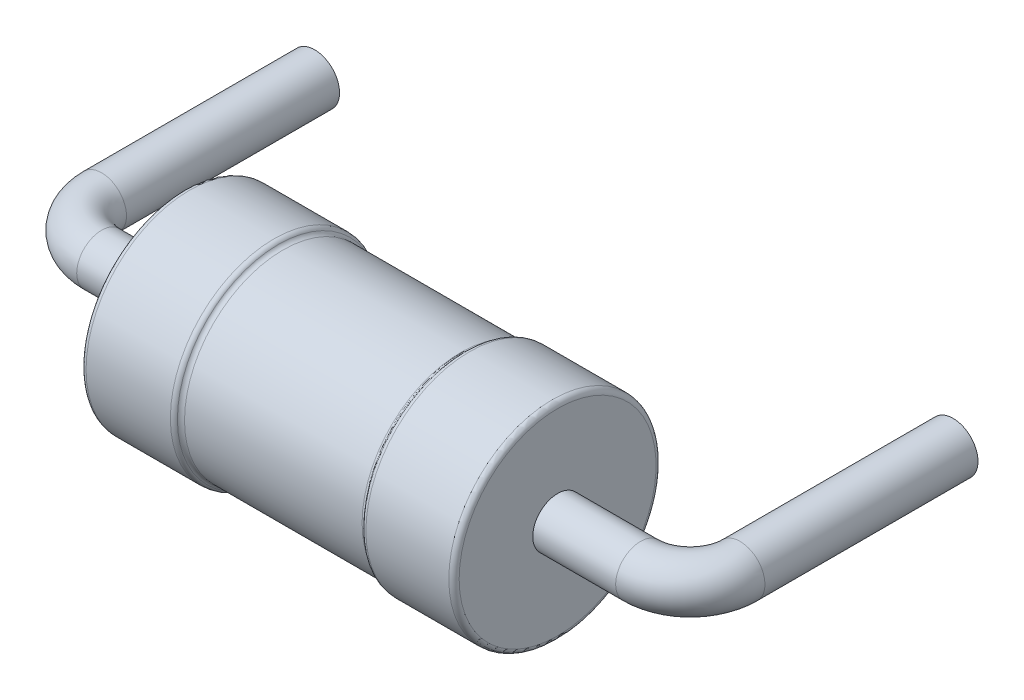
ISO-10303-21;
HEADER;
FILE_DESCRIPTION(('STEP AP214'),'2;1');
FILE_NAME('part.step','',(''),(''),'','','');
FILE_SCHEMA(('AUTOMOTIVE_DESIGN { 1 0 10303 214 1 1 1 1 }'));
ENDSEC;
DATA;
#1=APPLICATION_CONTEXT('core data for automotive mechanical design processes');
#2=APPLICATION_PROTOCOL_DEFINITION('international standard','automotive_design',2000,#1);
#3=PRODUCT_CONTEXT('',#1,'mechanical');
#4=PRODUCT('Part','Part','',(#3));
#5=PRODUCT_RELATED_PRODUCT_CATEGORY('part','',(#4));
#6=PRODUCT_DEFINITION_FORMATION('','',#4);
#7=PRODUCT_DEFINITION_CONTEXT('part definition',#1,'design');
#8=PRODUCT_DEFINITION('design','',#6,#7);
#9=PRODUCT_DEFINITION_SHAPE('','',#8);
#10=(LENGTH_UNIT() NAMED_UNIT(*) SI_UNIT(.MILLI.,.METRE.));
#11=(NAMED_UNIT(*) PLANE_ANGLE_UNIT() SI_UNIT($,.RADIAN.));
#12=(NAMED_UNIT(*) SI_UNIT($,.STERADIAN.) SOLID_ANGLE_UNIT());
#13=UNCERTAINTY_MEASURE_WITH_UNIT(LENGTH_MEASURE(1.E-05),#10,'distance_accuracy_value','');
#14=(GEOMETRIC_REPRESENTATION_CONTEXT(3) GLOBAL_UNCERTAINTY_ASSIGNED_CONTEXT((#13)) GLOBAL_UNIT_ASSIGNED_CONTEXT((#10,
#11,#12)) REPRESENTATION_CONTEXT('',''));
#15=CARTESIAN_POINT('',(0.,0.,0.));
#16=DIRECTION('',(0.,0.,1.));
#17=DIRECTION('',(1.,0.,0.));
#18=AXIS2_PLACEMENT_3D('',#15,#16,#17);
#19=CARTESIAN_POINT('',(1.1875,0.,1.25));
#20=DIRECTION('',(-1.,0.,0.));
#21=DIRECTION('',(0.,0.,1.));
#22=AXIS2_PLACEMENT_3D('',#19,#20,#21);
#23=TOROIDAL_SURFACE('',#22,1.1875,0.0625);
#24=CARTESIAN_POINT('',(1.13337341226347,0.,1.25));
#25=DIRECTION('',(-1.,0.,0.));
#26=DIRECTION('',(0.,0.,1.));
#27=AXIS2_PLACEMENT_3D('',#24,#25,#26);
#28=CIRCLE('',#27,1.21875);
#29=CARTESIAN_POINT('',(1.13337341226347,0.,0.03125));
#30=VERTEX_POINT('',#29);
#31=CARTESIAN_POINT('',(1.13337341226347,0.,2.46875));
#32=VERTEX_POINT('',#31);
#33=EDGE_CURVE('E216',#30,#32,#28,.T.);
#34=ORIENTED_EDGE('',*,*,#33,.F.);
#35=CARTESIAN_POINT('',(1.1875,0.,0.0625));
#36=DIRECTION('',(0.,-1.,0.));
#37=DIRECTION('',(0.,0.,-1.));
#38=AXIS2_PLACEMENT_3D('',#35,#36,#37);
#39=CIRCLE('',#38,0.0625);
#40=CARTESIAN_POINT('',(1.1875,0.,0.));
#41=VERTEX_POINT('',#40);
#42=EDGE_CURVE('E11',#30,#41,#39,.T.);
#43=ORIENTED_EDGE('',*,*,#42,.T.);
#44=CARTESIAN_POINT('',(1.1875,0.,1.25));
#45=DIRECTION('',(-1.,0.,0.));
#46=DIRECTION('',(0.,0.,1.));
#47=AXIS2_PLACEMENT_3D('',#44,#45,#46);
#48=CIRCLE('',#47,1.25);
#49=CARTESIAN_POINT('',(1.1875,0.,2.5));
#50=VERTEX_POINT('',#49);
#51=EDGE_CURVE('E20',#41,#50,#48,.T.);
#52=ORIENTED_EDGE('',*,*,#51,.T.);
#53=CARTESIAN_POINT('',(1.1875,0.,1.25));
#54=DIRECTION('',(-1.,0.,0.));
#55=DIRECTION('',(0.,0.,1.));
#56=AXIS2_PLACEMENT_3D('',#53,#54,#55);
#57=CIRCLE('',#56,1.25);
#58=EDGE_CURVE('E27',#50,#41,#57,.T.);
#59=ORIENTED_EDGE('',*,*,#58,.T.);
#60=ORIENTED_EDGE('',*,*,#42,.F.);
#61=CARTESIAN_POINT('',(1.13337341226347,0.,1.25));
#62=DIRECTION('',(-1.,0.,0.));
#63=DIRECTION('',(0.,0.,1.));
#64=AXIS2_PLACEMENT_3D('',#61,#62,#63);
#65=CIRCLE('',#64,1.21875);
#66=EDGE_CURVE('E168',#32,#30,#65,.T.);
#67=ORIENTED_EDGE('',*,*,#66,.F.);
#68=EDGE_LOOP('',(#34,#43,#52,#59,#60,#67));
#69=FACE_BOUND('',#68,.T.);
#70=ADVANCED_FACE('F16',(#69),#23,.T.);
#71=CARTESIAN_POINT('',(2.25,0.,1.25));
#72=DIRECTION('',(1.,0.,0.));
#73=DIRECTION('',(0.,0.,1.));
#74=AXIS2_PLACEMENT_3D('',#71,#72,#73);
#75=PLANE('',#74);
#76=CARTESIAN_POINT('',(2.25,0.,1.25));
#77=DIRECTION('',(-1.,0.,0.));
#78=DIRECTION('',(0.,0.,-1.));
#79=AXIS2_PLACEMENT_3D('',#76,#77,#78);
#80=CIRCLE('',#79,0.3);
#81=CARTESIAN_POINT('',(2.25,0.,1.55));
#82=VERTEX_POINT('',#81);
#83=EDGE_CURVE('E106',#82,#82,#80,.T.);
#84=ORIENTED_EDGE('',*,*,#83,.T.);
#85=EDGE_LOOP('',(#84));
#86=FACE_BOUND('',#85,.T.);
#87=CARTESIAN_POINT('',(2.25,0.,1.25));
#88=DIRECTION('',(-1.,0.,0.));
#89=DIRECTION('',(0.,0.,1.));
#90=AXIS2_PLACEMENT_3D('',#87,#88,#89);
#91=CIRCLE('',#90,1.1875);
#92=CARTESIAN_POINT('',(2.25,0.,2.4375));
#93=VERTEX_POINT('',#92);
#94=EDGE_CURVE('E178',#93,#93,#91,.T.);
#95=ORIENTED_EDGE('',*,*,#94,.F.);
#96=EDGE_LOOP('',(#95));
#97=FACE_BOUND('',#96,.T.);
#98=ADVANCED_FACE('F418',(#86,#97),#75,.T.);
#99=CARTESIAN_POINT('',(1.6875,0.,1.25));
#100=DIRECTION('',(1.,0.,0.));
#101=DIRECTION('',(0.,0.,-1.));
#102=AXIS2_PLACEMENT_3D('',#99,#100,#101);
#103=CYLINDRICAL_SURFACE('',#102,1.25);
#104=CARTESIAN_POINT('',(2.1875,0.,1.25));
#105=DIRECTION('',(1.,0.,0.));
#106=DIRECTION('',(0.,0.,1.));
#107=AXIS2_PLACEMENT_3D('',#104,#105,#106);
#108=CIRCLE('',#107,1.25);
#109=CARTESIAN_POINT('',(2.1875,0.,2.5));
#110=VERTEX_POINT('',#109);
#111=EDGE_CURVE('E221',#110,#110,#108,.T.);
#112=ORIENTED_EDGE('',*,*,#111,.F.);
#113=DIRECTION('',(-1.,0.,0.));
#114=VECTOR('',#113,1.);
#115=CARTESIAN_POINT('',(1.6875,0.,2.5));
#116=LINE('',#115,#114);
#117=EDGE_CURVE('E217',#110,#50,#116,.T.);
#118=ORIENTED_EDGE('',*,*,#117,.T.);
#119=ORIENTED_EDGE('',*,*,#51,.F.);
#120=ORIENTED_EDGE('',*,*,#58,.F.);
#121=ORIENTED_EDGE('',*,*,#117,.F.);
#122=EDGE_LOOP('',(#112,#118,#119,#120,#121));
#123=FACE_BOUND('',#122,.T.);
#124=ADVANCED_FACE('F392',(#123),#103,.T.);
#125=CARTESIAN_POINT('',(2.1875,0.,1.25));
#126=DIRECTION('',(1.,0.,0.));
#127=DIRECTION('',(0.,0.,-1.));
#128=AXIS2_PLACEMENT_3D('',#125,#126,#127);
#129=TOROIDAL_SURFACE('',#128,1.1875,0.0625);
#130=ORIENTED_EDGE('',*,*,#94,.T.);
#131=CARTESIAN_POINT('',(2.1875,0.,2.4375));
#132=DIRECTION('',(0.,-1.,0.));
#133=DIRECTION('',(0.,0.,1.));
#134=AXIS2_PLACEMENT_3D('',#131,#132,#133);
#135=CIRCLE('',#134,0.0625);
#136=EDGE_CURVE('E189',#93,#110,#135,.T.);
#137=ORIENTED_EDGE('',*,*,#136,.T.);
#138=ORIENTED_EDGE('',*,*,#111,.T.);
#139=ORIENTED_EDGE('',*,*,#136,.F.);
#140=EDGE_LOOP('',(#130,#137,#138,#139));
#141=FACE_BOUND('',#140,.T.);
#142=ADVANCED_FACE('F387',(#141),#129,.T.);
#143=CARTESIAN_POINT('',(-1.0625,0.,1.25));
#144=DIRECTION('',(-1.,0.,0.));
#145=DIRECTION('',(0.,0.,1.));
#146=AXIS2_PLACEMENT_3D('',#143,#144,#145);
#147=TOROIDAL_SURFACE('',#146,1.25,0.0625);
#148=CARTESIAN_POINT('',(-1.11662658773653,0.,1.25));
#149=DIRECTION('',(-1.,0.,0.));
#150=DIRECTION('',(0.,0.,1.));
#151=AXIS2_PLACEMENT_3D('',#148,#149,#150);
#152=CIRCLE('',#151,1.21875);
#153=CARTESIAN_POINT('',(-1.11662658773653,0.,0.03125));
#154=VERTEX_POINT('',#153);
#155=CARTESIAN_POINT('',(-1.11662658773653,0.,2.46875));
#156=VERTEX_POINT('',#155);
#157=EDGE_CURVE('E163',#154,#156,#152,.T.);
#158=ORIENTED_EDGE('',*,*,#157,.F.);
#159=CARTESIAN_POINT('',(-1.0625,0.,0.));
#160=DIRECTION('',(0.,1.,0.));
#161=DIRECTION('',(0.,0.,-1.));
#162=AXIS2_PLACEMENT_3D('',#159,#160,#161);
#163=CIRCLE('',#162,0.0625);
#164=CARTESIAN_POINT('',(-1.0625,0.,0.0625));
#165=VERTEX_POINT('',#164);
#166=EDGE_CURVE('E176',#154,#165,#163,.T.);
#167=ORIENTED_EDGE('',*,*,#166,.T.);
#168=CARTESIAN_POINT('',(-1.0625,0.,1.25));
#169=DIRECTION('',(-1.,0.,0.));
#170=DIRECTION('',(0.,0.,1.));
#171=AXIS2_PLACEMENT_3D('',#168,#169,#170);
#172=CIRCLE('',#171,1.1875);
#173=CARTESIAN_POINT('',(-1.0625,0.,2.4375));
#174=VERTEX_POINT('',#173);
#175=EDGE_CURVE('E191',#165,#174,#172,.T.);
#176=ORIENTED_EDGE('',*,*,#175,.T.);
#177=CARTESIAN_POINT('',(-1.0625,0.,1.25));
#178=DIRECTION('',(-1.,0.,0.));
#179=DIRECTION('',(0.,0.,1.));
#180=AXIS2_PLACEMENT_3D('',#177,#178,#179);
#181=CIRCLE('',#180,1.1875);
#182=EDGE_CURVE('E179',#174,#165,#181,.T.);
#183=ORIENTED_EDGE('',*,*,#182,.T.);
#184=ORIENTED_EDGE('',*,*,#166,.F.);
#185=CARTESIAN_POINT('',(-1.11662658773653,0.,1.25));
#186=DIRECTION('',(-1.,0.,0.));
#187=DIRECTION('',(0.,0.,1.));
#188=AXIS2_PLACEMENT_3D('',#185,#186,#187);
#189=CIRCLE('',#188,1.21875);
#190=EDGE_CURVE('E147',#156,#154,#189,.T.);
#191=ORIENTED_EDGE('',*,*,#190,.F.);
#192=EDGE_LOOP('',(#158,#167,#176,#183,#184,#191));
#193=FACE_BOUND('',#192,.T.);
#194=ADVANCED_FACE('F391',(#193),#147,.F.);
#195=CARTESIAN_POINT('',(0.,0.,1.25));
#196=DIRECTION('',(1.,0.,0.));
#197=DIRECTION('',(0.,0.,-1.));
#198=AXIS2_PLACEMENT_3D('',#195,#196,#197);
#199=CYLINDRICAL_SURFACE('',#198,1.1875);
#200=CARTESIAN_POINT('',(1.07924682452695,0.,1.25));
#201=DIRECTION('',(1.,0.,0.));
#202=DIRECTION('',(0.,0.,1.));
#203=AXIS2_PLACEMENT_3D('',#200,#201,#202);
#204=CIRCLE('',#203,1.1875);
#205=CARTESIAN_POINT('',(1.07924682452695,0.,2.4375));
#206=VERTEX_POINT('',#205);
#207=EDGE_CURVE('E172',#206,#206,#204,.T.);
#208=ORIENTED_EDGE('',*,*,#207,.F.);
#209=DIRECTION('',(-1.,0.,0.));
#210=VECTOR('',#209,1.);
#211=CARTESIAN_POINT('',(0.,0.,2.4375));
#212=LINE('',#211,#210);
#213=EDGE_CURVE('E157',#206,#174,#212,.T.);
#214=ORIENTED_EDGE('',*,*,#213,.T.);
#215=ORIENTED_EDGE('',*,*,#175,.F.);
#216=ORIENTED_EDGE('',*,*,#182,.F.);
#217=ORIENTED_EDGE('',*,*,#213,.F.);
#218=EDGE_LOOP('',(#208,#214,#215,#216,#217));
#219=FACE_BOUND('',#218,.T.);
#220=ADVANCED_FACE('F381',(#219),#199,.T.);
#221=CARTESIAN_POINT('',(1.07924682452695,0.,1.25));
#222=DIRECTION('',(1.,0.,0.));
#223=DIRECTION('',(0.,0.,-1.));
#224=AXIS2_PLACEMENT_3D('',#221,#222,#223);
#225=TOROIDAL_SURFACE('',#224,1.25,0.0625);
#226=ORIENTED_EDGE('',*,*,#33,.T.);
#227=CARTESIAN_POINT('',(1.07924682452695,0.,2.5));
#228=DIRECTION('',(0.,1.,0.));
#229=DIRECTION('',(0.,0.,1.));
#230=AXIS2_PLACEMENT_3D('',#227,#228,#229);
#231=CIRCLE('',#230,0.0625);
#232=EDGE_CURVE('E212',#32,#206,#231,.T.);
#233=ORIENTED_EDGE('',*,*,#232,.T.);
#234=ORIENTED_EDGE('',*,*,#207,.T.);
#235=ORIENTED_EDGE('',*,*,#232,.F.);
#236=ORIENTED_EDGE('',*,*,#66,.T.);
#237=EDGE_LOOP('',(#226,#233,#234,#235,#236));
#238=FACE_BOUND('',#237,.T.);
#239=ADVANCED_FACE('F18',(#238),#225,.F.);
#240=CARTESIAN_POINT('',(-2.25,0.,1.25));
#241=DIRECTION('',(-1.,0.,0.));
#242=DIRECTION('',(0.,0.,1.));
#243=AXIS2_PLACEMENT_3D('',#240,#241,#242);
#244=PLANE('',#243);
#245=CARTESIAN_POINT('',(-2.25,0.,1.25));
#246=DIRECTION('',(1.,0.,0.));
#247=DIRECTION('',(0.,0.,-1.));
#248=AXIS2_PLACEMENT_3D('',#245,#246,#247);
#249=CIRCLE('',#248,0.3);
#250=CARTESIAN_POINT('',(-2.25,0.,1.55));
#251=VERTEX_POINT('',#250);
#252=EDGE_CURVE('E164',#251,#251,#249,.T.);
#253=ORIENTED_EDGE('',*,*,#252,.T.);
#254=EDGE_LOOP('',(#253));
#255=FACE_BOUND('',#254,.T.);
#256=CARTESIAN_POINT('',(-2.25,0.,1.25));
#257=DIRECTION('',(1.,0.,0.));
#258=DIRECTION('',(0.,0.,1.));
#259=AXIS2_PLACEMENT_3D('',#256,#257,#258);
#260=CIRCLE('',#259,1.1875);
#261=CARTESIAN_POINT('',(-2.25,0.,0.0625));
#262=VERTEX_POINT('',#261);
#263=EDGE_CURVE('E137',#262,#262,#260,.T.);
#264=ORIENTED_EDGE('',*,*,#263,.F.);
#265=EDGE_LOOP('',(#264));
#266=FACE_BOUND('',#265,.T.);
#267=ADVANCED_FACE('F380',(#255,#266),#244,.T.);
#268=CARTESIAN_POINT('',(-2.1875,0.,1.25));
#269=DIRECTION('',(-1.,0.,0.));
#270=DIRECTION('',(0.,0.,1.));
#271=AXIS2_PLACEMENT_3D('',#268,#269,#270);
#272=TOROIDAL_SURFACE('',#271,1.1875,0.0625);
#273=ORIENTED_EDGE('',*,*,#263,.T.);
#274=CARTESIAN_POINT('',(-2.1875,0.,0.0625));
#275=DIRECTION('',(0.,-1.,0.));
#276=DIRECTION('',(0.,0.,-1.));
#277=AXIS2_PLACEMENT_3D('',#274,#275,#276);
#278=CIRCLE('',#277,0.0625);
#279=CARTESIAN_POINT('',(-2.1875,0.,0.));
#280=VERTEX_POINT('',#279);
#281=EDGE_CURVE('E141',#262,#280,#278,.T.);
#282=ORIENTED_EDGE('',*,*,#281,.T.);
#283=CARTESIAN_POINT('',(-2.1875,0.,1.25));
#284=DIRECTION('',(-1.,0.,0.));
#285=DIRECTION('',(0.,0.,1.));
#286=AXIS2_PLACEMENT_3D('',#283,#284,#285);
#287=CIRCLE('',#286,1.25);
#288=CARTESIAN_POINT('',(-2.1875,0.,2.5));
#289=VERTEX_POINT('',#288);
#290=EDGE_CURVE('E134',#280,#289,#287,.T.);
#291=ORIENTED_EDGE('',*,*,#290,.T.);
#292=CARTESIAN_POINT('',(-2.1875,0.,1.25));
#293=DIRECTION('',(-1.,0.,0.));
#294=DIRECTION('',(0.,0.,1.));
#295=AXIS2_PLACEMENT_3D('',#292,#293,#294);
#296=CIRCLE('',#295,1.25);
#297=EDGE_CURVE('E127',#289,#280,#296,.T.);
#298=ORIENTED_EDGE('',*,*,#297,.T.);
#299=ORIENTED_EDGE('',*,*,#281,.F.);
#300=EDGE_LOOP('',(#273,#282,#291,#298,#299));
#301=FACE_BOUND('',#300,.T.);
#302=ADVANCED_FACE('F140',(#301),#272,.T.);
#303=CARTESIAN_POINT('',(-1.6875,0.,1.25));
#304=DIRECTION('',(1.,0.,0.));
#305=DIRECTION('',(0.,0.,-1.));
#306=AXIS2_PLACEMENT_3D('',#303,#304,#305);
#307=CYLINDRICAL_SURFACE('',#306,1.25);
#308=CARTESIAN_POINT('',(-1.17075317547305,0.,1.25));
#309=DIRECTION('',(1.,0.,0.));
#310=DIRECTION('',(0.,0.,1.));
#311=AXIS2_PLACEMENT_3D('',#308,#309,#310);
#312=CIRCLE('',#311,1.25);
#313=CARTESIAN_POINT('',(-1.17075317547305,0.,2.5));
#314=VERTEX_POINT('',#313);
#315=EDGE_CURVE('E144',#314,#314,#312,.T.);
#316=ORIENTED_EDGE('',*,*,#315,.F.);
#317=DIRECTION('',(-1.,0.,0.));
#318=VECTOR('',#317,1.);
#319=CARTESIAN_POINT('',(-1.6875,0.,2.5));
#320=LINE('',#319,#318);
#321=EDGE_CURVE('E132',#314,#289,#320,.T.);
#322=ORIENTED_EDGE('',*,*,#321,.T.);
#323=ORIENTED_EDGE('',*,*,#290,.F.);
#324=ORIENTED_EDGE('',*,*,#297,.F.);
#325=ORIENTED_EDGE('',*,*,#321,.F.);
#326=EDGE_LOOP('',(#316,#322,#323,#324,#325));
#327=FACE_BOUND('',#326,.T.);
#328=ADVANCED_FACE('F130',(#327),#307,.T.);
#329=CARTESIAN_POINT('',(-1.17075317547305,0.,1.25));
#330=DIRECTION('',(1.,0.,0.));
#331=DIRECTION('',(0.,0.,-1.));
#332=AXIS2_PLACEMENT_3D('',#329,#330,#331);
#333=TOROIDAL_SURFACE('',#332,1.1875,0.0625);
#334=ORIENTED_EDGE('',*,*,#157,.T.);
#335=CARTESIAN_POINT('',(-1.17075317547305,0.,2.4375));
#336=DIRECTION('',(0.,-1.,0.));
#337=DIRECTION('',(0.,0.,1.));
#338=AXIS2_PLACEMENT_3D('',#335,#336,#337);
#339=CIRCLE('',#338,0.0625);
#340=EDGE_CURVE('E167',#156,#314,#339,.T.);
#341=ORIENTED_EDGE('',*,*,#340,.T.);
#342=ORIENTED_EDGE('',*,*,#315,.T.);
#343=ORIENTED_EDGE('',*,*,#340,.F.);
#344=ORIENTED_EDGE('',*,*,#190,.T.);
#345=EDGE_LOOP('',(#334,#341,#342,#343,#344));
#346=FACE_BOUND('',#345,.T.);
#347=ADVANCED_FACE('F427',(#346),#333,.T.);
#348=CARTESIAN_POINT('',(-2.75,0.,1.25));
#349=DIRECTION('',(1.,0.,0.));
#350=DIRECTION('',(0.,0.,-1.));
#351=AXIS2_PLACEMENT_3D('',#348,#349,#350);
#352=CYLINDRICAL_SURFACE('',#351,0.3);
#353=ORIENTED_EDGE('',*,*,#252,.F.);
#354=DIRECTION('',(-1.,0.,0.));
#355=VECTOR('',#354,1.);
#356=CARTESIAN_POINT('',(-2.75,0.,1.55));
#357=LINE('',#356,#355);
#358=CARTESIAN_POINT('',(-3.25,0.,1.55));
#359=VERTEX_POINT('',#358);
#360=EDGE_CURVE('E159',#251,#359,#357,.T.);
#361=ORIENTED_EDGE('',*,*,#360,.T.);
#362=CARTESIAN_POINT('',(-3.25,0.,1.25));
#363=DIRECTION('',(1.,0.,0.));
#364=DIRECTION('',(0.,0.,-1.));
#365=AXIS2_PLACEMENT_3D('',#362,#363,#364);
#366=CIRCLE('',#365,0.3);
#367=CARTESIAN_POINT('',(-3.25,0.,0.95));
#368=VERTEX_POINT('',#367);
#369=EDGE_CURVE('E266',#359,#368,#366,.T.);
#370=ORIENTED_EDGE('',*,*,#369,.T.);
#371=CARTESIAN_POINT('',(-3.25,0.,1.25));
#372=DIRECTION('',(1.,0.,0.));
#373=DIRECTION('',(0.,0.,-1.));
#374=AXIS2_PLACEMENT_3D('',#371,#372,#373);
#375=CIRCLE('',#374,0.3);
#376=EDGE_CURVE('E262',#368,#359,#375,.T.);
#377=ORIENTED_EDGE('',*,*,#376,.T.);
#378=ORIENTED_EDGE('',*,*,#360,.F.);
#379=EDGE_LOOP('',(#353,#361,#370,#377,#378));
#380=FACE_BOUND('',#379,.T.);
#381=ADVANCED_FACE('F402',(#380),#352,.T.);
#382=CARTESIAN_POINT('',(-3.25,0.,0.65));
#383=DIRECTION('',(0.,1.,0.));
#384=DIRECTION('',(-1.,0.,0.));
#385=AXIS2_PLACEMENT_3D('',#382,#383,#384);
#386=TOROIDAL_SURFACE('',#385,0.6,0.3);
#387=ORIENTED_EDGE('',*,*,#369,.F.);
#388=ORIENTED_EDGE('',*,*,#376,.F.);
#389=CARTESIAN_POINT('',(-3.25,0.,0.65));
#390=DIRECTION('',(0.,-1.,0.));
#391=DIRECTION('',(-1.,0.,0.));
#392=AXIS2_PLACEMENT_3D('',#389,#390,#391);
#393=CIRCLE('',#392,0.3);
#394=CARTESIAN_POINT('',(-3.55,0.,0.65));
#395=VERTEX_POINT('',#394);
#396=EDGE_CURVE('E265',#368,#395,#393,.T.);
#397=ORIENTED_EDGE('',*,*,#396,.T.);
#398=CARTESIAN_POINT('',(-3.85,0.,0.65));
#399=DIRECTION('',(0.,0.,1.));
#400=DIRECTION('',(1.,0.,0.));
#401=AXIS2_PLACEMENT_3D('',#398,#399,#400);
#402=CIRCLE('',#401,0.3);
#403=CARTESIAN_POINT('',(-4.15,0.,0.65));
#404=VERTEX_POINT('',#403);
#405=EDGE_CURVE('E93',#395,#404,#402,.T.);
#406=ORIENTED_EDGE('',*,*,#405,.T.);
#407=CARTESIAN_POINT('',(-3.85,0.,0.65));
#408=DIRECTION('',(0.,0.,1.));
#409=DIRECTION('',(1.,0.,0.));
#410=AXIS2_PLACEMENT_3D('',#407,#408,#409);
#411=CIRCLE('',#410,0.3);
#412=EDGE_CURVE('E173',#404,#395,#411,.T.);
#413=ORIENTED_EDGE('',*,*,#412,.T.);
#414=ORIENTED_EDGE('',*,*,#396,.F.);
#415=EDGE_LOOP('',(#387,#388,#397,#406,#413,#414));
#416=FACE_BOUND('',#415,.T.);
#417=ADVANCED_FACE('F397',(#416),#386,.T.);
#418=CARTESIAN_POINT('',(-3.85,0.,-1.92));
#419=DIRECTION('',(0.,0.,1.));
#420=DIRECTION('',(1.,0.,0.));
#421=AXIS2_PLACEMENT_3D('',#418,#419,#420);
#422=PLANE('',#421);
#423=CARTESIAN_POINT('',(-3.85,0.,-1.92));
#424=DIRECTION('',(0.,0.,1.));
#425=DIRECTION('',(1.,0.,0.));
#426=AXIS2_PLACEMENT_3D('',#423,#424,#425);
#427=CIRCLE('',#426,0.3);
#428=CARTESIAN_POINT('',(-4.15,0.,-1.92));
#429=VERTEX_POINT('',#428);
#430=EDGE_CURVE('E222',#429,#429,#427,.T.);
#431=ORIENTED_EDGE('',*,*,#430,.F.);
#432=EDGE_LOOP('',(#431));
#433=FACE_BOUND('',#432,.T.);
#434=ADVANCED_FACE('F401',(#433),#422,.F.);
#435=CARTESIAN_POINT('',(-3.85,0.,-0.635));
#436=DIRECTION('',(0.,0.,1.));
#437=DIRECTION('',(1.,0.,0.));
#438=AXIS2_PLACEMENT_3D('',#435,#436,#437);
#439=CYLINDRICAL_SURFACE('',#438,0.3);
#440=ORIENTED_EDGE('',*,*,#412,.F.);
#441=DIRECTION('',(0.,0.,-1.));
#442=VECTOR('',#441,1.);
#443=CARTESIAN_POINT('',(-4.15,0.,-0.635));
#444=LINE('',#443,#442);
#445=EDGE_CURVE('E175',#404,#429,#444,.T.);
#446=ORIENTED_EDGE('',*,*,#445,.T.);
#447=ORIENTED_EDGE('',*,*,#430,.T.);
#448=ORIENTED_EDGE('',*,*,#445,.F.);
#449=ORIENTED_EDGE('',*,*,#405,.F.);
#450=EDGE_LOOP('',(#440,#446,#447,#448,#449));
#451=FACE_BOUND('',#450,.T.);
#452=ADVANCED_FACE('F456',(#451),#439,.T.);
#453=CARTESIAN_POINT('',(2.75,0.,1.25));
#454=DIRECTION('',(1.,0.,0.));
#455=DIRECTION('',(0.,0.,-1.));
#456=AXIS2_PLACEMENT_3D('',#453,#454,#455);
#457=CYLINDRICAL_SURFACE('',#456,0.3);
#458=CARTESIAN_POINT('',(3.25,0.,1.25));
#459=DIRECTION('',(1.,0.,0.));
#460=DIRECTION('',(0.,0.,-1.));
#461=AXIS2_PLACEMENT_3D('',#458,#459,#460);
#462=CIRCLE('',#461,0.3);
#463=CARTESIAN_POINT('',(3.25,0.,1.55));
#464=VERTEX_POINT('',#463);
#465=CARTESIAN_POINT('',(3.25,0.,0.95));
#466=VERTEX_POINT('',#465);
#467=EDGE_CURVE('E202',#464,#466,#462,.T.);
#468=ORIENTED_EDGE('',*,*,#467,.F.);
#469=DIRECTION('',(-1.,0.,0.));
#470=VECTOR('',#469,1.);
#471=CARTESIAN_POINT('',(2.75,0.,1.55));
#472=LINE('',#471,#470);
#473=EDGE_CURVE('E204',#464,#82,#472,.T.);
#474=ORIENTED_EDGE('',*,*,#473,.T.);
#475=ORIENTED_EDGE('',*,*,#83,.F.);
#476=ORIENTED_EDGE('',*,*,#473,.F.);
#477=CARTESIAN_POINT('',(3.25,0.,1.25));
#478=DIRECTION('',(1.,0.,0.));
#479=DIRECTION('',(0.,0.,-1.));
#480=AXIS2_PLACEMENT_3D('',#477,#478,#479);
#481=CIRCLE('',#480,0.3);
#482=EDGE_CURVE('E205',#466,#464,#481,.T.);
#483=ORIENTED_EDGE('',*,*,#482,.F.);
#484=EDGE_LOOP('',(#468,#474,#475,#476,#483));
#485=FACE_BOUND('',#484,.T.);
#486=ADVANCED_FACE('F451',(#485),#457,.T.);
#487=CARTESIAN_POINT('',(3.25,0.,0.65));
#488=DIRECTION('',(0.,1.,0.));
#489=DIRECTION('',(1.,0.,0.));
#490=AXIS2_PLACEMENT_3D('',#487,#488,#489);
#491=TOROIDAL_SURFACE('',#490,0.6,0.3);
#492=CARTESIAN_POINT('',(3.85,0.,0.65));
#493=DIRECTION('',(0.,0.,-1.));
#494=DIRECTION('',(-1.,0.,0.));
#495=AXIS2_PLACEMENT_3D('',#492,#493,#494);
#496=CIRCLE('',#495,0.3);
#497=CARTESIAN_POINT('',(4.15,0.,0.65));
#498=VERTEX_POINT('',#497);
#499=CARTESIAN_POINT('',(3.55,0.,0.65));
#500=VERTEX_POINT('',#499);
#501=EDGE_CURVE('E200',#498,#500,#496,.T.);
#502=ORIENTED_EDGE('',*,*,#501,.F.);
#503=CARTESIAN_POINT('',(3.85,0.,0.65));
#504=DIRECTION('',(0.,0.,-1.));
#505=DIRECTION('',(-1.,0.,0.));
#506=AXIS2_PLACEMENT_3D('',#503,#504,#505);
#507=CIRCLE('',#506,0.3);
#508=EDGE_CURVE('E230',#500,#498,#507,.T.);
#509=ORIENTED_EDGE('',*,*,#508,.F.);
#510=CARTESIAN_POINT('',(3.25,0.,0.65));
#511=DIRECTION('',(0.,-1.,0.));
#512=DIRECTION('',(1.,0.,0.));
#513=AXIS2_PLACEMENT_3D('',#510,#511,#512);
#514=CIRCLE('',#513,0.3);
#515=EDGE_CURVE('E232',#500,#466,#514,.T.);
#516=ORIENTED_EDGE('',*,*,#515,.T.);
#517=ORIENTED_EDGE('',*,*,#482,.T.);
#518=ORIENTED_EDGE('',*,*,#467,.T.);
#519=ORIENTED_EDGE('',*,*,#515,.F.);
#520=EDGE_LOOP('',(#502,#509,#516,#517,#518,#519));
#521=FACE_BOUND('',#520,.T.);
#522=ADVANCED_FACE('F250',(#521),#491,.T.);
#523=CARTESIAN_POINT('',(3.85,0.,-1.92));
#524=DIRECTION('',(0.,0.,-1.));
#525=DIRECTION('',(0.,-1.,0.));
#526=AXIS2_PLACEMENT_3D('',#523,#524,#525);
#527=PLANE('',#526);
#528=CARTESIAN_POINT('',(3.85,0.,-1.92));
#529=DIRECTION('',(0.,0.,-1.));
#530=DIRECTION('',(-1.,0.,0.));
#531=AXIS2_PLACEMENT_3D('',#528,#529,#530);
#532=CIRCLE('',#531,0.3);
#533=CARTESIAN_POINT('',(4.15,0.,-1.92));
#534=VERTEX_POINT('',#533);
#535=EDGE_CURVE('E211',#534,#534,#532,.T.);
#536=ORIENTED_EDGE('',*,*,#535,.T.);
#537=EDGE_LOOP('',(#536));
#538=FACE_BOUND('',#537,.T.);
#539=ADVANCED_FACE('F410',(#538),#527,.T.);
#540=CARTESIAN_POINT('',(3.85,0.,-0.635));
#541=DIRECTION('',(0.,0.,-1.));
#542=DIRECTION('',(-1.,0.,0.));
#543=AXIS2_PLACEMENT_3D('',#540,#541,#542);
#544=CYLINDRICAL_SURFACE('',#543,0.3);
#545=ORIENTED_EDGE('',*,*,#535,.F.);
#546=DIRECTION('',(0.,0.,1.));
#547=VECTOR('',#546,1.);
#548=CARTESIAN_POINT('',(4.15,0.,-0.635));
#549=LINE('',#548,#547);
#550=EDGE_CURVE('E207',#534,#498,#549,.T.);
#551=ORIENTED_EDGE('',*,*,#550,.T.);
#552=ORIENTED_EDGE('',*,*,#501,.T.);
#553=ORIENTED_EDGE('',*,*,#508,.T.);
#554=ORIENTED_EDGE('',*,*,#550,.F.);
#555=EDGE_LOOP('',(#545,#551,#552,#553,#554));
#556=FACE_BOUND('',#555,.T.);
#557=ADVANCED_FACE('F247',(#556),#544,.T.);
#558=CLOSED_SHELL('',(#70,#98,#124,#142,#194,#220,#239,#267,#302,#328,#347,#381,#417,#434,#452,
#486,#522,#539,#557));
#559=MANIFOLD_SOLID_BREP('B1',#558);
#560=ADVANCED_BREP_SHAPE_REPRESENTATION('',(#18,#559),#14);
#561=SHAPE_DEFINITION_REPRESENTATION(#9,#560);
ENDSEC;
END-ISO-10303-21;
